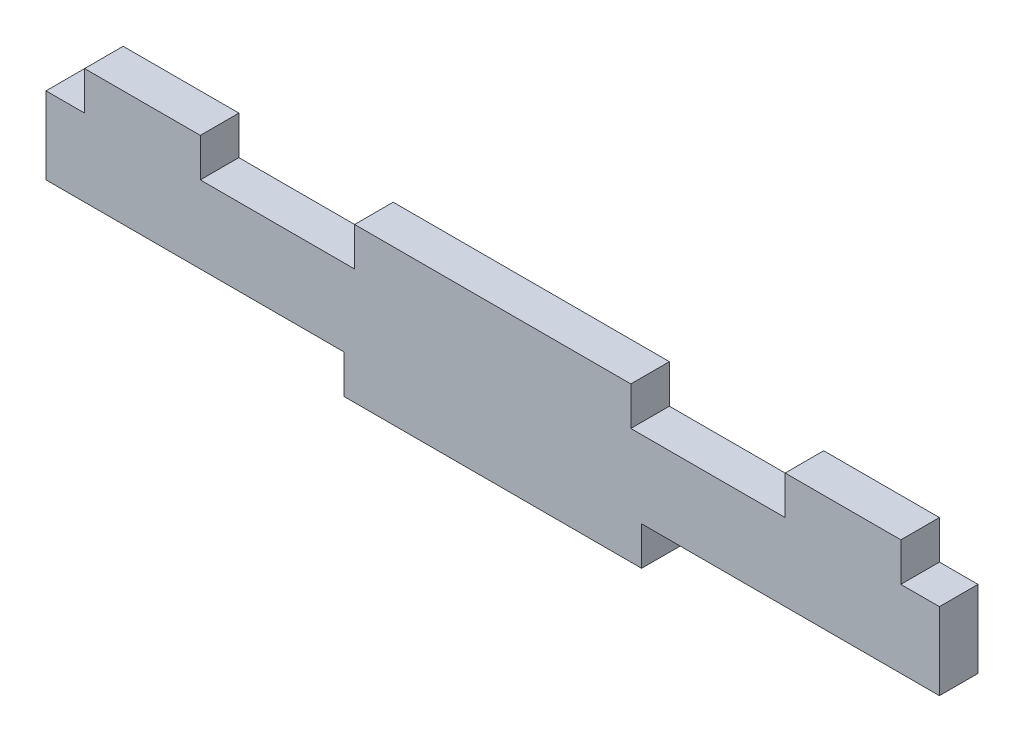
ISO-10303-21;
HEADER;
FILE_DESCRIPTION(('STEP AP214'),'2;1');
FILE_NAME('part.step','',(''),(''),'','','');
FILE_SCHEMA(('AUTOMOTIVE_DESIGN { 1 0 10303 214 1 1 1 1 }'));
ENDSEC;
DATA;
#1=APPLICATION_CONTEXT('core data for automotive mechanical design processes');
#2=APPLICATION_PROTOCOL_DEFINITION('international standard','automotive_design',2000,#1);
#3=PRODUCT_CONTEXT('',#1,'mechanical');
#4=PRODUCT('Part','Part','',(#3));
#5=PRODUCT_RELATED_PRODUCT_CATEGORY('part','',(#4));
#6=PRODUCT_DEFINITION_FORMATION('','',#4);
#7=PRODUCT_DEFINITION_CONTEXT('part definition',#1,'design');
#8=PRODUCT_DEFINITION('design','',#6,#7);
#9=PRODUCT_DEFINITION_SHAPE('','',#8);
#10=(LENGTH_UNIT() NAMED_UNIT(*) SI_UNIT(.MILLI.,.METRE.));
#11=(NAMED_UNIT(*) PLANE_ANGLE_UNIT() SI_UNIT($,.RADIAN.));
#12=(NAMED_UNIT(*) SI_UNIT($,.STERADIAN.) SOLID_ANGLE_UNIT());
#13=UNCERTAINTY_MEASURE_WITH_UNIT(LENGTH_MEASURE(1.E-05),#10,'distance_accuracy_value','');
#14=(GEOMETRIC_REPRESENTATION_CONTEXT(3) GLOBAL_UNCERTAINTY_ASSIGNED_CONTEXT((#13)) GLOBAL_UNIT_ASSIGNED_CONTEXT((#10,
#11,#12)) REPRESENTATION_CONTEXT('',''));
#15=CARTESIAN_POINT('',(0.,0.,0.));
#16=DIRECTION('',(0.,0.,1.));
#17=DIRECTION('',(1.,0.,0.));
#18=AXIS2_PLACEMENT_3D('',#15,#16,#17);
#19=CARTESIAN_POINT('',(38.6,0.,5.));
#20=DIRECTION('',(0.,1.,0.));
#21=DIRECTION('',(0.,0.,1.));
#22=AXIS2_PLACEMENT_3D('',#19,#20,#21);
#23=PLANE('',#22);
#24=DIRECTION('',(1.,0.,0.));
#25=VECTOR('',#24,1.);
#26=CARTESIAN_POINT('',(38.6,0.,0.));
#27=LINE('',#26,#25);
#28=CARTESIAN_POINT('',(38.6,0.,0.));
#29=VERTEX_POINT('',#28);
#30=CARTESIAN_POINT('',(77.2,0.,0.));
#31=VERTEX_POINT('',#30);
#32=EDGE_CURVE('E200',#29,#31,#27,.T.);
#33=ORIENTED_EDGE('',*,*,#32,.T.);
#34=DIRECTION('',(0.,0.,-1.));
#35=VECTOR('',#34,1.);
#36=CARTESIAN_POINT('',(77.2,0.,5.));
#37=LINE('',#36,#35);
#38=CARTESIAN_POINT('',(77.2,0.,5.));
#39=VERTEX_POINT('',#38);
#40=EDGE_CURVE('E11',#39,#31,#37,.T.);
#41=ORIENTED_EDGE('',*,*,#40,.F.);
#42=DIRECTION('',(1.,0.,0.));
#43=VECTOR('',#42,1.);
#44=CARTESIAN_POINT('',(38.6,0.,5.));
#45=LINE('',#44,#43);
#46=CARTESIAN_POINT('',(38.6,0.,5.));
#47=VERTEX_POINT('',#46);
#48=EDGE_CURVE('E239',#47,#39,#45,.T.);
#49=ORIENTED_EDGE('',*,*,#48,.F.);
#50=DIRECTION('',(0.,0.,-1.));
#51=VECTOR('',#50,1.);
#52=CARTESIAN_POINT('',(38.6,0.,5.));
#53=LINE('',#52,#51);
#54=EDGE_CURVE('E196',#47,#29,#53,.T.);
#55=ORIENTED_EDGE('',*,*,#54,.T.);
#56=EDGE_LOOP('',(#33,#41,#49,#55));
#57=FACE_BOUND('',#56,.T.);
#58=ADVANCED_FACE('F32',(#57),#23,.F.);
#59=CARTESIAN_POINT('',(77.2,0.,5.));
#60=DIRECTION('',(-1.,0.,0.));
#61=DIRECTION('',(0.,0.,1.));
#62=AXIS2_PLACEMENT_3D('',#59,#60,#61);
#63=PLANE('',#62);
#64=DIRECTION('',(0.,1.,0.));
#65=VECTOR('',#64,1.);
#66=CARTESIAN_POINT('',(77.2,0.,0.));
#67=LINE('',#66,#65);
#68=CARTESIAN_POINT('',(77.2,5.,0.));
#69=VERTEX_POINT('',#68);
#70=EDGE_CURVE('E203',#31,#69,#67,.T.);
#71=ORIENTED_EDGE('',*,*,#70,.T.);
#72=DIRECTION('',(0.,0.,-1.));
#73=VECTOR('',#72,1.);
#74=CARTESIAN_POINT('',(77.2,5.,5.));
#75=LINE('',#74,#73);
#76=CARTESIAN_POINT('',(77.2,5.,5.));
#77=VERTEX_POINT('',#76);
#78=EDGE_CURVE('E40',#77,#69,#75,.T.);
#79=ORIENTED_EDGE('',*,*,#78,.F.);
#80=DIRECTION('',(0.,1.,0.));
#81=VECTOR('',#80,1.);
#82=CARTESIAN_POINT('',(77.2,0.,5.));
#83=LINE('',#82,#81);
#84=EDGE_CURVE('E126',#39,#77,#83,.T.);
#85=ORIENTED_EDGE('',*,*,#84,.F.);
#86=ORIENTED_EDGE('',*,*,#40,.T.);
#87=EDGE_LOOP('',(#71,#79,#85,#86));
#88=FACE_BOUND('',#87,.T.);
#89=ADVANCED_FACE('F290',(#88),#63,.F.);
#90=CARTESIAN_POINT('',(115.8,5.00000000000001,5.));
#91=DIRECTION('',(0.,1.,0.));
#92=DIRECTION('',(-1.,0.,0.));
#93=AXIS2_PLACEMENT_3D('',#90,#91,#92);
#94=PLANE('',#93);
#95=DIRECTION('',(1.,0.,0.));
#96=VECTOR('',#95,1.);
#97=CARTESIAN_POINT('',(115.8,5.00000000000001,0.));
#98=LINE('',#97,#96);
#99=CARTESIAN_POINT('',(115.8,5.00000000000001,0.));
#100=VERTEX_POINT('',#99);
#101=EDGE_CURVE('E206',#69,#100,#98,.T.);
#102=ORIENTED_EDGE('',*,*,#101,.T.);
#103=DIRECTION('',(0.,0.,-1.));
#104=VECTOR('',#103,1.);
#105=CARTESIAN_POINT('',(115.8,5.00000000000001,5.));
#106=LINE('',#105,#104);
#107=CARTESIAN_POINT('',(115.8,5.00000000000001,5.));
#108=VERTEX_POINT('',#107);
#109=EDGE_CURVE('E282',#108,#100,#106,.T.);
#110=ORIENTED_EDGE('',*,*,#109,.F.);
#111=DIRECTION('',(1.,0.,0.));
#112=VECTOR('',#111,1.);
#113=CARTESIAN_POINT('',(77.2,5.,5.));
#114=LINE('',#113,#112);
#115=EDGE_CURVE('E289',#77,#108,#114,.T.);
#116=ORIENTED_EDGE('',*,*,#115,.F.);
#117=ORIENTED_EDGE('',*,*,#78,.T.);
#118=EDGE_LOOP('',(#102,#110,#116,#117));
#119=FACE_BOUND('',#118,.T.);
#120=ADVANCED_FACE('F287',(#119),#94,.F.);
#121=CARTESIAN_POINT('',(115.8,5.00000000000001,5.));
#122=DIRECTION('',(-1.,0.,0.));
#123=DIRECTION('',(0.,-1.,0.));
#124=AXIS2_PLACEMENT_3D('',#121,#122,#123);
#125=PLANE('',#124);
#126=DIRECTION('',(0.,1.,0.));
#127=VECTOR('',#126,1.);
#128=CARTESIAN_POINT('',(115.8,5.00000000000001,0.));
#129=LINE('',#128,#127);
#130=CARTESIAN_POINT('',(115.8,15.,0.));
#131=VERTEX_POINT('',#130);
#132=EDGE_CURVE('E208',#100,#131,#129,.T.);
#133=ORIENTED_EDGE('',*,*,#132,.T.);
#134=DIRECTION('',(0.,0.,-1.));
#135=VECTOR('',#134,1.);
#136=CARTESIAN_POINT('',(115.8,15.,5.));
#137=LINE('',#136,#135);
#138=CARTESIAN_POINT('',(115.8,15.,5.));
#139=VERTEX_POINT('',#138);
#140=EDGE_CURVE('E279',#139,#131,#137,.T.);
#141=ORIENTED_EDGE('',*,*,#140,.F.);
#142=DIRECTION('',(0.,1.,0.));
#143=VECTOR('',#142,1.);
#144=CARTESIAN_POINT('',(115.8,5.00000000000001,5.));
#145=LINE('',#144,#143);
#146=EDGE_CURVE('E309',#108,#139,#145,.T.);
#147=ORIENTED_EDGE('',*,*,#146,.F.);
#148=ORIENTED_EDGE('',*,*,#109,.T.);
#149=EDGE_LOOP('',(#133,#141,#147,#148));
#150=FACE_BOUND('',#149,.T.);
#151=ADVANCED_FACE('F300',(#150),#125,.F.);
#152=CARTESIAN_POINT('',(115.8,15.,5.));
#153=DIRECTION('',(0.,-1.,0.));
#154=DIRECTION('',(1.,0.,0.));
#155=AXIS2_PLACEMENT_3D('',#152,#153,#154);
#156=PLANE('',#155);
#157=DIRECTION('',(-1.,0.,0.));
#158=VECTOR('',#157,1.);
#159=CARTESIAN_POINT('',(115.8,15.,0.));
#160=LINE('',#159,#158);
#161=CARTESIAN_POINT('',(110.8,15.,0.));
#162=VERTEX_POINT('',#161);
#163=EDGE_CURVE('E210',#131,#162,#160,.T.);
#164=ORIENTED_EDGE('',*,*,#163,.T.);
#165=DIRECTION('',(0.,0.,-1.));
#166=VECTOR('',#165,1.);
#167=CARTESIAN_POINT('',(110.8,15.,5.));
#168=LINE('',#167,#166);
#169=CARTESIAN_POINT('',(110.8,15.,5.));
#170=VERTEX_POINT('',#169);
#171=EDGE_CURVE('E276',#170,#162,#168,.T.);
#172=ORIENTED_EDGE('',*,*,#171,.F.);
#173=DIRECTION('',(-1.,0.,0.));
#174=VECTOR('',#173,1.);
#175=CARTESIAN_POINT('',(115.8,15.,5.));
#176=LINE('',#175,#174);
#177=EDGE_CURVE('E306',#139,#170,#176,.T.);
#178=ORIENTED_EDGE('',*,*,#177,.F.);
#179=ORIENTED_EDGE('',*,*,#140,.T.);
#180=EDGE_LOOP('',(#164,#172,#178,#179));
#181=FACE_BOUND('',#180,.T.);
#182=ADVANCED_FACE('F304',(#181),#156,.F.);
#183=CARTESIAN_POINT('',(110.8,15.,5.));
#184=DIRECTION('',(-1.,0.,0.));
#185=DIRECTION('',(0.,0.,1.));
#186=AXIS2_PLACEMENT_3D('',#183,#184,#185);
#187=PLANE('',#186);
#188=DIRECTION('',(0.,1.,0.));
#189=VECTOR('',#188,1.);
#190=CARTESIAN_POINT('',(110.8,15.,0.));
#191=LINE('',#190,#189);
#192=CARTESIAN_POINT('',(110.8,20.,0.));
#193=VERTEX_POINT('',#192);
#194=EDGE_CURVE('E212',#162,#193,#191,.T.);
#195=ORIENTED_EDGE('',*,*,#194,.T.);
#196=DIRECTION('',(0.,0.,-1.));
#197=VECTOR('',#196,1.);
#198=CARTESIAN_POINT('',(110.8,20.,5.));
#199=LINE('',#198,#197);
#200=CARTESIAN_POINT('',(110.8,20.,5.));
#201=VERTEX_POINT('',#200);
#202=EDGE_CURVE('E273',#201,#193,#199,.T.);
#203=ORIENTED_EDGE('',*,*,#202,.F.);
#204=DIRECTION('',(0.,1.,0.));
#205=VECTOR('',#204,1.);
#206=CARTESIAN_POINT('',(110.8,15.,5.));
#207=LINE('',#206,#205);
#208=EDGE_CURVE('E308',#170,#201,#207,.T.);
#209=ORIENTED_EDGE('',*,*,#208,.F.);
#210=ORIENTED_EDGE('',*,*,#171,.T.);
#211=EDGE_LOOP('',(#195,#203,#209,#210));
#212=FACE_BOUND('',#211,.T.);
#213=ADVANCED_FACE('F389',(#212),#187,.F.);
#214=CARTESIAN_POINT('',(95.8,20.,5.));
#215=DIRECTION('',(0.,-1.,0.));
#216=DIRECTION('',(1.,0.,0.));
#217=AXIS2_PLACEMENT_3D('',#214,#215,#216);
#218=PLANE('',#217);
#219=DIRECTION('',(-1.,0.,0.));
#220=VECTOR('',#219,1.);
#221=CARTESIAN_POINT('',(95.8,20.,0.));
#222=LINE('',#221,#220);
#223=CARTESIAN_POINT('',(95.8,20.,0.));
#224=VERTEX_POINT('',#223);
#225=EDGE_CURVE('E214',#193,#224,#222,.T.);
#226=ORIENTED_EDGE('',*,*,#225,.T.);
#227=DIRECTION('',(0.,0.,-1.));
#228=VECTOR('',#227,1.);
#229=CARTESIAN_POINT('',(95.8,20.,5.));
#230=LINE('',#229,#228);
#231=CARTESIAN_POINT('',(95.8,20.,5.));
#232=VERTEX_POINT('',#231);
#233=EDGE_CURVE('E270',#232,#224,#230,.T.);
#234=ORIENTED_EDGE('',*,*,#233,.F.);
#235=DIRECTION('',(-1.,0.,0.));
#236=VECTOR('',#235,1.);
#237=CARTESIAN_POINT('',(95.8,20.,5.));
#238=LINE('',#237,#236);
#239=EDGE_CURVE('E311',#201,#232,#238,.T.);
#240=ORIENTED_EDGE('',*,*,#239,.F.);
#241=ORIENTED_EDGE('',*,*,#202,.T.);
#242=EDGE_LOOP('',(#226,#234,#240,#241));
#243=FACE_BOUND('',#242,.T.);
#244=ADVANCED_FACE('F386',(#243),#218,.F.);
#245=CARTESIAN_POINT('',(95.8,20.,5.));
#246=DIRECTION('',(1.,0.,0.));
#247=DIRECTION('',(0.,0.,-1.));
#248=AXIS2_PLACEMENT_3D('',#245,#246,#247);
#249=PLANE('',#248);
#250=DIRECTION('',(0.,-1.,0.));
#251=VECTOR('',#250,1.);
#252=CARTESIAN_POINT('',(95.8,20.,0.));
#253=LINE('',#252,#251);
#254=CARTESIAN_POINT('',(95.8,15.,0.));
#255=VERTEX_POINT('',#254);
#256=EDGE_CURVE('E216',#224,#255,#253,.T.);
#257=ORIENTED_EDGE('',*,*,#256,.T.);
#258=DIRECTION('',(0.,0.,-1.));
#259=VECTOR('',#258,1.);
#260=CARTESIAN_POINT('',(95.8,15.,5.));
#261=LINE('',#260,#259);
#262=CARTESIAN_POINT('',(95.8,15.,5.));
#263=VERTEX_POINT('',#262);
#264=EDGE_CURVE('E267',#263,#255,#261,.T.);
#265=ORIENTED_EDGE('',*,*,#264,.F.);
#266=DIRECTION('',(0.,-1.,0.));
#267=VECTOR('',#266,1.);
#268=CARTESIAN_POINT('',(95.8,20.,5.));
#269=LINE('',#268,#267);
#270=EDGE_CURVE('E317',#232,#263,#269,.T.);
#271=ORIENTED_EDGE('',*,*,#270,.F.);
#272=ORIENTED_EDGE('',*,*,#233,.T.);
#273=EDGE_LOOP('',(#257,#265,#271,#272));
#274=FACE_BOUND('',#273,.T.);
#275=ADVANCED_FACE('F382',(#274),#249,.F.);
#276=CARTESIAN_POINT('',(95.8,15.,5.));
#277=DIRECTION('',(0.,-1.,0.));
#278=DIRECTION('',(1.,0.,0.));
#279=AXIS2_PLACEMENT_3D('',#276,#277,#278);
#280=PLANE('',#279);
#281=DIRECTION('',(-1.,0.,0.));
#282=VECTOR('',#281,1.);
#283=CARTESIAN_POINT('',(95.8,15.,0.));
#284=LINE('',#283,#282);
#285=CARTESIAN_POINT('',(75.8,15.,0.));
#286=VERTEX_POINT('',#285);
#287=EDGE_CURVE('E218',#255,#286,#284,.T.);
#288=ORIENTED_EDGE('',*,*,#287,.T.);
#289=DIRECTION('',(0.,0.,-1.));
#290=VECTOR('',#289,1.);
#291=CARTESIAN_POINT('',(75.8,15.,5.));
#292=LINE('',#291,#290);
#293=CARTESIAN_POINT('',(75.8,15.,5.));
#294=VERTEX_POINT('',#293);
#295=EDGE_CURVE('E264',#294,#286,#292,.T.);
#296=ORIENTED_EDGE('',*,*,#295,.F.);
#297=DIRECTION('',(-1.,0.,0.));
#298=VECTOR('',#297,1.);
#299=CARTESIAN_POINT('',(95.8,15.,5.));
#300=LINE('',#299,#298);
#301=EDGE_CURVE('E319',#263,#294,#300,.T.);
#302=ORIENTED_EDGE('',*,*,#301,.F.);
#303=ORIENTED_EDGE('',*,*,#264,.T.);
#304=EDGE_LOOP('',(#288,#296,#302,#303));
#305=FACE_BOUND('',#304,.T.);
#306=ADVANCED_FACE('F377',(#305),#280,.F.);
#307=CARTESIAN_POINT('',(75.8,20.,5.));
#308=DIRECTION('',(-1.,0.,0.));
#309=DIRECTION('',(0.,0.,1.));
#310=AXIS2_PLACEMENT_3D('',#307,#308,#309);
#311=PLANE('',#310);
#312=DIRECTION('',(0.,1.,0.));
#313=VECTOR('',#312,1.);
#314=CARTESIAN_POINT('',(75.8,20.,0.));
#315=LINE('',#314,#313);
#316=CARTESIAN_POINT('',(75.8,20.,0.));
#317=VERTEX_POINT('',#316);
#318=EDGE_CURVE('E220',#286,#317,#315,.T.);
#319=ORIENTED_EDGE('',*,*,#318,.T.);
#320=DIRECTION('',(0.,0.,-1.));
#321=VECTOR('',#320,1.);
#322=CARTESIAN_POINT('',(75.8,20.,5.));
#323=LINE('',#322,#321);
#324=CARTESIAN_POINT('',(75.8,20.,5.));
#325=VERTEX_POINT('',#324);
#326=EDGE_CURVE('E261',#325,#317,#323,.T.);
#327=ORIENTED_EDGE('',*,*,#326,.F.);
#328=DIRECTION('',(0.,1.,0.));
#329=VECTOR('',#328,1.);
#330=CARTESIAN_POINT('',(75.8,20.,5.));
#331=LINE('',#330,#329);
#332=EDGE_CURVE('E321',#294,#325,#331,.T.);
#333=ORIENTED_EDGE('',*,*,#332,.F.);
#334=ORIENTED_EDGE('',*,*,#295,.T.);
#335=EDGE_LOOP('',(#319,#327,#333,#334));
#336=FACE_BOUND('',#335,.T.);
#337=ADVANCED_FACE('F371',(#336),#311,.F.);
#338=CARTESIAN_POINT('',(40.,20.,5.));
#339=DIRECTION('',(0.,-1.,0.));
#340=DIRECTION('',(1.,0.,0.));
#341=AXIS2_PLACEMENT_3D('',#338,#339,#340);
#342=PLANE('',#341);
#343=DIRECTION('',(-1.,0.,0.));
#344=VECTOR('',#343,1.);
#345=CARTESIAN_POINT('',(40.,20.,0.));
#346=LINE('',#345,#344);
#347=CARTESIAN_POINT('',(40.,20.,0.));
#348=VERTEX_POINT('',#347);
#349=EDGE_CURVE('E222',#317,#348,#346,.T.);
#350=ORIENTED_EDGE('',*,*,#349,.T.);
#351=DIRECTION('',(0.,0.,-1.));
#352=VECTOR('',#351,1.);
#353=CARTESIAN_POINT('',(40.,20.,5.));
#354=LINE('',#353,#352);
#355=CARTESIAN_POINT('',(40.,20.,5.));
#356=VERTEX_POINT('',#355);
#357=EDGE_CURVE('E258',#356,#348,#354,.T.);
#358=ORIENTED_EDGE('',*,*,#357,.F.);
#359=DIRECTION('',(-1.,0.,0.));
#360=VECTOR('',#359,1.);
#361=CARTESIAN_POINT('',(40.,20.,5.));
#362=LINE('',#361,#360);
#363=EDGE_CURVE('E323',#325,#356,#362,.T.);
#364=ORIENTED_EDGE('',*,*,#363,.F.);
#365=ORIENTED_EDGE('',*,*,#326,.T.);
#366=EDGE_LOOP('',(#350,#358,#364,#365));
#367=FACE_BOUND('',#366,.T.);
#368=ADVANCED_FACE('F367',(#367),#342,.F.);
#369=CARTESIAN_POINT('',(40.,20.,5.));
#370=DIRECTION('',(1.,0.,0.));
#371=DIRECTION('',(0.,0.,-1.));
#372=AXIS2_PLACEMENT_3D('',#369,#370,#371);
#373=PLANE('',#372);
#374=DIRECTION('',(0.,-1.,0.));
#375=VECTOR('',#374,1.);
#376=CARTESIAN_POINT('',(40.,20.,0.));
#377=LINE('',#376,#375);
#378=CARTESIAN_POINT('',(40.,15.,0.));
#379=VERTEX_POINT('',#378);
#380=EDGE_CURVE('E224',#348,#379,#377,.T.);
#381=ORIENTED_EDGE('',*,*,#380,.T.);
#382=DIRECTION('',(0.,0.,-1.));
#383=VECTOR('',#382,1.);
#384=CARTESIAN_POINT('',(40.,15.,5.));
#385=LINE('',#384,#383);
#386=CARTESIAN_POINT('',(40.,15.,5.));
#387=VERTEX_POINT('',#386);
#388=EDGE_CURVE('E255',#387,#379,#385,.T.);
#389=ORIENTED_EDGE('',*,*,#388,.F.);
#390=DIRECTION('',(0.,-1.,0.));
#391=VECTOR('',#390,1.);
#392=CARTESIAN_POINT('',(40.,20.,5.));
#393=LINE('',#392,#391);
#394=EDGE_CURVE('E325',#356,#387,#393,.T.);
#395=ORIENTED_EDGE('',*,*,#394,.F.);
#396=ORIENTED_EDGE('',*,*,#357,.T.);
#397=EDGE_LOOP('',(#381,#389,#395,#396));
#398=FACE_BOUND('',#397,.T.);
#399=ADVANCED_FACE('F362',(#398),#373,.F.);
#400=CARTESIAN_POINT('',(20.,15.,5.));
#401=DIRECTION('',(0.,-1.,0.));
#402=DIRECTION('',(0.,0.,-1.));
#403=AXIS2_PLACEMENT_3D('',#400,#401,#402);
#404=PLANE('',#403);
#405=DIRECTION('',(-1.,0.,0.));
#406=VECTOR('',#405,1.);
#407=CARTESIAN_POINT('',(20.,15.,0.));
#408=LINE('',#407,#406);
#409=CARTESIAN_POINT('',(20.,15.,0.));
#410=VERTEX_POINT('',#409);
#411=EDGE_CURVE('E226',#379,#410,#408,.T.);
#412=ORIENTED_EDGE('',*,*,#411,.T.);
#413=DIRECTION('',(0.,0.,-1.));
#414=VECTOR('',#413,1.);
#415=CARTESIAN_POINT('',(20.,15.,5.));
#416=LINE('',#415,#414);
#417=CARTESIAN_POINT('',(20.,15.,5.));
#418=VERTEX_POINT('',#417);
#419=EDGE_CURVE('E252',#418,#410,#416,.T.);
#420=ORIENTED_EDGE('',*,*,#419,.F.);
#421=DIRECTION('',(-1.,0.,0.));
#422=VECTOR('',#421,1.);
#423=CARTESIAN_POINT('',(20.,15.,5.));
#424=LINE('',#423,#422);
#425=EDGE_CURVE('E327',#387,#418,#424,.T.);
#426=ORIENTED_EDGE('',*,*,#425,.F.);
#427=ORIENTED_EDGE('',*,*,#388,.T.);
#428=EDGE_LOOP('',(#412,#420,#426,#427));
#429=FACE_BOUND('',#428,.T.);
#430=ADVANCED_FACE('F356',(#429),#404,.F.);
#431=CARTESIAN_POINT('',(20.,20.,5.));
#432=DIRECTION('',(-1.,0.,0.));
#433=DIRECTION('',(0.,-1.,0.));
#434=AXIS2_PLACEMENT_3D('',#431,#432,#433);
#435=PLANE('',#434);
#436=DIRECTION('',(0.,1.,0.));
#437=VECTOR('',#436,1.);
#438=CARTESIAN_POINT('',(20.,20.,0.));
#439=LINE('',#438,#437);
#440=CARTESIAN_POINT('',(20.,20.,0.));
#441=VERTEX_POINT('',#440);
#442=EDGE_CURVE('E228',#410,#441,#439,.T.);
#443=ORIENTED_EDGE('',*,*,#442,.T.);
#444=DIRECTION('',(0.,0.,-1.));
#445=VECTOR('',#444,1.);
#446=CARTESIAN_POINT('',(20.,20.,5.));
#447=LINE('',#446,#445);
#448=CARTESIAN_POINT('',(20.,20.,5.));
#449=VERTEX_POINT('',#448);
#450=EDGE_CURVE('E249',#449,#441,#447,.T.);
#451=ORIENTED_EDGE('',*,*,#450,.F.);
#452=DIRECTION('',(0.,1.,0.));
#453=VECTOR('',#452,1.);
#454=CARTESIAN_POINT('',(20.,20.,5.));
#455=LINE('',#454,#453);
#456=EDGE_CURVE('E329',#418,#449,#455,.T.);
#457=ORIENTED_EDGE('',*,*,#456,.F.);
#458=ORIENTED_EDGE('',*,*,#419,.T.);
#459=EDGE_LOOP('',(#443,#451,#457,#458));
#460=FACE_BOUND('',#459,.T.);
#461=ADVANCED_FACE('F352',(#460),#435,.F.);
#462=CARTESIAN_POINT('',(5.,20.,5.));
#463=DIRECTION('',(0.,-1.,0.));
#464=DIRECTION('',(0.,0.,-1.));
#465=AXIS2_PLACEMENT_3D('',#462,#463,#464);
#466=PLANE('',#465);
#467=DIRECTION('',(-1.,0.,0.));
#468=VECTOR('',#467,1.);
#469=CARTESIAN_POINT('',(5.,20.,0.));
#470=LINE('',#469,#468);
#471=CARTESIAN_POINT('',(5.,20.,0.));
#472=VERTEX_POINT('',#471);
#473=EDGE_CURVE('E230',#441,#472,#470,.T.);
#474=ORIENTED_EDGE('',*,*,#473,.T.);
#475=DIRECTION('',(0.,0.,-1.));
#476=VECTOR('',#475,1.);
#477=CARTESIAN_POINT('',(5.,20.,5.));
#478=LINE('',#477,#476);
#479=CARTESIAN_POINT('',(5.,20.,5.));
#480=VERTEX_POINT('',#479);
#481=EDGE_CURVE('E246',#480,#472,#478,.T.);
#482=ORIENTED_EDGE('',*,*,#481,.F.);
#483=DIRECTION('',(-1.,0.,0.));
#484=VECTOR('',#483,1.);
#485=CARTESIAN_POINT('',(5.,20.,5.));
#486=LINE('',#485,#484);
#487=EDGE_CURVE('E331',#449,#480,#486,.T.);
#488=ORIENTED_EDGE('',*,*,#487,.F.);
#489=ORIENTED_EDGE('',*,*,#450,.T.);
#490=EDGE_LOOP('',(#474,#482,#488,#489));
#491=FACE_BOUND('',#490,.T.);
#492=ADVANCED_FACE('F348',(#491),#466,.F.);
#493=CARTESIAN_POINT('',(5.,15.,5.));
#494=DIRECTION('',(1.,0.,0.));
#495=DIRECTION('',(0.,0.,-1.));
#496=AXIS2_PLACEMENT_3D('',#493,#494,#495);
#497=PLANE('',#496);
#498=DIRECTION('',(0.,-1.,0.));
#499=VECTOR('',#498,1.);
#500=CARTESIAN_POINT('',(5.,15.,0.));
#501=LINE('',#500,#499);
#502=CARTESIAN_POINT('',(5.,15.,0.));
#503=VERTEX_POINT('',#502);
#504=EDGE_CURVE('E232',#472,#503,#501,.T.);
#505=ORIENTED_EDGE('',*,*,#504,.T.);
#506=DIRECTION('',(0.,0.,-1.));
#507=VECTOR('',#506,1.);
#508=CARTESIAN_POINT('',(5.,15.,5.));
#509=LINE('',#508,#507);
#510=CARTESIAN_POINT('',(5.,15.,5.));
#511=VERTEX_POINT('',#510);
#512=EDGE_CURVE('E243',#511,#503,#509,.T.);
#513=ORIENTED_EDGE('',*,*,#512,.F.);
#514=DIRECTION('',(0.,-1.,0.));
#515=VECTOR('',#514,1.);
#516=CARTESIAN_POINT('',(5.,15.,5.));
#517=LINE('',#516,#515);
#518=EDGE_CURVE('E333',#480,#511,#517,.T.);
#519=ORIENTED_EDGE('',*,*,#518,.F.);
#520=ORIENTED_EDGE('',*,*,#481,.T.);
#521=EDGE_LOOP('',(#505,#513,#519,#520));
#522=FACE_BOUND('',#521,.T.);
#523=ADVANCED_FACE('F339',(#522),#497,.F.);
#524=CARTESIAN_POINT('',(0.,15.,5.));
#525=DIRECTION('',(0.,-1.,0.));
#526=DIRECTION('',(0.,0.,-1.));
#527=AXIS2_PLACEMENT_3D('',#524,#525,#526);
#528=PLANE('',#527);
#529=DIRECTION('',(-1.,0.,0.));
#530=VECTOR('',#529,1.);
#531=CARTESIAN_POINT('',(0.,15.,0.));
#532=LINE('',#531,#530);
#533=CARTESIAN_POINT('',(0.,15.,0.));
#534=VERTEX_POINT('',#533);
#535=EDGE_CURVE('E234',#503,#534,#532,.T.);
#536=ORIENTED_EDGE('',*,*,#535,.T.);
#537=DIRECTION('',(0.,0.,-1.));
#538=VECTOR('',#537,1.);
#539=CARTESIAN_POINT('',(0.,15.,5.));
#540=LINE('',#539,#538);
#541=CARTESIAN_POINT('',(0.,15.,5.));
#542=VERTEX_POINT('',#541);
#543=EDGE_CURVE('E191',#542,#534,#540,.T.);
#544=ORIENTED_EDGE('',*,*,#543,.F.);
#545=DIRECTION('',(-1.,0.,0.));
#546=VECTOR('',#545,1.);
#547=CARTESIAN_POINT('',(0.,15.,5.));
#548=LINE('',#547,#546);
#549=EDGE_CURVE('E181',#511,#542,#548,.T.);
#550=ORIENTED_EDGE('',*,*,#549,.F.);
#551=ORIENTED_EDGE('',*,*,#512,.T.);
#552=EDGE_LOOP('',(#536,#544,#550,#551));
#553=FACE_BOUND('',#552,.T.);
#554=ADVANCED_FACE('F343',(#553),#528,.F.);
#555=CARTESIAN_POINT('',(0.,5.,5.));
#556=DIRECTION('',(1.,0.,0.));
#557=DIRECTION('',(0.,0.,-1.));
#558=AXIS2_PLACEMENT_3D('',#555,#556,#557);
#559=PLANE('',#558);
#560=DIRECTION('',(0.,-1.,0.));
#561=VECTOR('',#560,1.);
#562=CARTESIAN_POINT('',(0.,5.,0.));
#563=LINE('',#562,#561);
#564=CARTESIAN_POINT('',(0.,5.,0.));
#565=VERTEX_POINT('',#564);
#566=EDGE_CURVE('E190',#534,#565,#563,.T.);
#567=ORIENTED_EDGE('',*,*,#566,.T.);
#568=DIRECTION('',(0.,0.,-1.));
#569=VECTOR('',#568,1.);
#570=CARTESIAN_POINT('',(0.,5.,5.));
#571=LINE('',#570,#569);
#572=CARTESIAN_POINT('',(0.,5.,5.));
#573=VERTEX_POINT('',#572);
#574=EDGE_CURVE('E187',#573,#565,#571,.T.);
#575=ORIENTED_EDGE('',*,*,#574,.F.);
#576=DIRECTION('',(0.,-1.,0.));
#577=VECTOR('',#576,1.);
#578=CARTESIAN_POINT('',(0.,5.,5.));
#579=LINE('',#578,#577);
#580=EDGE_CURVE('E175',#542,#573,#579,.T.);
#581=ORIENTED_EDGE('',*,*,#580,.F.);
#582=ORIENTED_EDGE('',*,*,#543,.T.);
#583=EDGE_LOOP('',(#567,#575,#581,#582));
#584=FACE_BOUND('',#583,.T.);
#585=ADVANCED_FACE('F188',(#584),#559,.F.);
#586=CARTESIAN_POINT('',(38.6,5.,5.));
#587=DIRECTION('',(0.,1.,0.));
#588=DIRECTION('',(-1.,0.,0.));
#589=AXIS2_PLACEMENT_3D('',#586,#587,#588);
#590=PLANE('',#589);
#591=DIRECTION('',(1.,0.,0.));
#592=VECTOR('',#591,1.);
#593=CARTESIAN_POINT('',(38.6,5.,0.));
#594=LINE('',#593,#592);
#595=CARTESIAN_POINT('',(38.6,5.,0.));
#596=VERTEX_POINT('',#595);
#597=EDGE_CURVE('E112',#565,#596,#594,.T.);
#598=ORIENTED_EDGE('',*,*,#597,.T.);
#599=DIRECTION('',(0.,0.,-1.));
#600=VECTOR('',#599,1.);
#601=CARTESIAN_POINT('',(38.6,5.,5.));
#602=LINE('',#601,#600);
#603=CARTESIAN_POINT('',(38.6,5.,5.));
#604=VERTEX_POINT('',#603);
#605=EDGE_CURVE('E192',#604,#596,#602,.T.);
#606=ORIENTED_EDGE('',*,*,#605,.F.);
#607=DIRECTION('',(1.,0.,0.));
#608=VECTOR('',#607,1.);
#609=CARTESIAN_POINT('',(0.,5.,5.));
#610=LINE('',#609,#608);
#611=EDGE_CURVE('E179',#573,#604,#610,.T.);
#612=ORIENTED_EDGE('',*,*,#611,.F.);
#613=ORIENTED_EDGE('',*,*,#574,.T.);
#614=EDGE_LOOP('',(#598,#606,#612,#613));
#615=FACE_BOUND('',#614,.T.);
#616=ADVANCED_FACE('F194',(#615),#590,.F.);
#617=CARTESIAN_POINT('',(38.6,0.,5.));
#618=DIRECTION('',(1.,0.,0.));
#619=DIRECTION('',(0.,0.,-1.));
#620=AXIS2_PLACEMENT_3D('',#617,#618,#619);
#621=PLANE('',#620);
#622=DIRECTION('',(0.,-1.,0.));
#623=VECTOR('',#622,1.);
#624=CARTESIAN_POINT('',(38.6,0.,0.));
#625=LINE('',#624,#623);
#626=EDGE_CURVE('E118',#596,#29,#625,.T.);
#627=ORIENTED_EDGE('',*,*,#626,.T.);
#628=ORIENTED_EDGE('',*,*,#54,.F.);
#629=DIRECTION('',(0.,-1.,0.));
#630=VECTOR('',#629,1.);
#631=CARTESIAN_POINT('',(38.6,0.,5.));
#632=LINE('',#631,#630);
#633=EDGE_CURVE('E48',#604,#47,#632,.T.);
#634=ORIENTED_EDGE('',*,*,#633,.F.);
#635=ORIENTED_EDGE('',*,*,#605,.T.);
#636=EDGE_LOOP('',(#627,#628,#634,#635));
#637=FACE_BOUND('',#636,.T.);
#638=ADVANCED_FACE('F404',(#637),#621,.F.);
#639=CARTESIAN_POINT('',(0.,0.,5.));
#640=DIRECTION('',(0.,0.,1.));
#641=DIRECTION('',(1.,0.,0.));
#642=AXIS2_PLACEMENT_3D('',#639,#640,#641);
#643=PLANE('',#642);
#644=ORIENTED_EDGE('',*,*,#48,.T.);
#645=ORIENTED_EDGE('',*,*,#84,.T.);
#646=ORIENTED_EDGE('',*,*,#115,.T.);
#647=ORIENTED_EDGE('',*,*,#146,.T.);
#648=ORIENTED_EDGE('',*,*,#177,.T.);
#649=ORIENTED_EDGE('',*,*,#208,.T.);
#650=ORIENTED_EDGE('',*,*,#239,.T.);
#651=ORIENTED_EDGE('',*,*,#270,.T.);
#652=ORIENTED_EDGE('',*,*,#301,.T.);
#653=ORIENTED_EDGE('',*,*,#332,.T.);
#654=ORIENTED_EDGE('',*,*,#363,.T.);
#655=ORIENTED_EDGE('',*,*,#394,.T.);
#656=ORIENTED_EDGE('',*,*,#425,.T.);
#657=ORIENTED_EDGE('',*,*,#456,.T.);
#658=ORIENTED_EDGE('',*,*,#487,.T.);
#659=ORIENTED_EDGE('',*,*,#518,.T.);
#660=ORIENTED_EDGE('',*,*,#549,.T.);
#661=ORIENTED_EDGE('',*,*,#580,.T.);
#662=ORIENTED_EDGE('',*,*,#611,.T.);
#663=ORIENTED_EDGE('',*,*,#633,.T.);
#664=EDGE_LOOP('',(#644,#645,#646,#647,#648,#649,#650,#651,#652,#653,#654,#655,#656,#657,#658,
#659,#660,#661,#662,#663));
#665=FACE_BOUND('',#664,.T.);
#666=ADVANCED_FACE('F177',(#665),#643,.T.);
#667=CARTESIAN_POINT('',(0.,0.,0.));
#668=DIRECTION('',(0.,0.,1.));
#669=DIRECTION('',(1.,0.,0.));
#670=AXIS2_PLACEMENT_3D('',#667,#668,#669);
#671=PLANE('',#670);
#672=ORIENTED_EDGE('',*,*,#32,.F.);
#673=ORIENTED_EDGE('',*,*,#626,.F.);
#674=ORIENTED_EDGE('',*,*,#597,.F.);
#675=ORIENTED_EDGE('',*,*,#566,.F.);
#676=ORIENTED_EDGE('',*,*,#535,.F.);
#677=ORIENTED_EDGE('',*,*,#504,.F.);
#678=ORIENTED_EDGE('',*,*,#473,.F.);
#679=ORIENTED_EDGE('',*,*,#442,.F.);
#680=ORIENTED_EDGE('',*,*,#411,.F.);
#681=ORIENTED_EDGE('',*,*,#380,.F.);
#682=ORIENTED_EDGE('',*,*,#349,.F.);
#683=ORIENTED_EDGE('',*,*,#318,.F.);
#684=ORIENTED_EDGE('',*,*,#287,.F.);
#685=ORIENTED_EDGE('',*,*,#256,.F.);
#686=ORIENTED_EDGE('',*,*,#225,.F.);
#687=ORIENTED_EDGE('',*,*,#194,.F.);
#688=ORIENTED_EDGE('',*,*,#163,.F.);
#689=ORIENTED_EDGE('',*,*,#132,.F.);
#690=ORIENTED_EDGE('',*,*,#101,.F.);
#691=ORIENTED_EDGE('',*,*,#70,.F.);
#692=EDGE_LOOP('',(#672,#673,#674,#675,#676,#677,#678,#679,#680,#681,#682,#683,#684,#685,#686,
#687,#688,#689,#690,#691));
#693=FACE_BOUND('',#692,.T.);
#694=ADVANCED_FACE('F294',(#693),#671,.F.);
#695=CLOSED_SHELL('',(#58,#89,#120,#151,#182,#213,#244,#275,#306,#337,#368,#399,#430,#461,#492,
#523,#554,#585,#616,#638,#666,#694));
#696=MANIFOLD_SOLID_BREP('B2',#695);
#697=ADVANCED_BREP_SHAPE_REPRESENTATION('',(#18,#696),#14);
#698=SHAPE_DEFINITION_REPRESENTATION(#9,#697);
ENDSEC;
END-ISO-10303-21;
